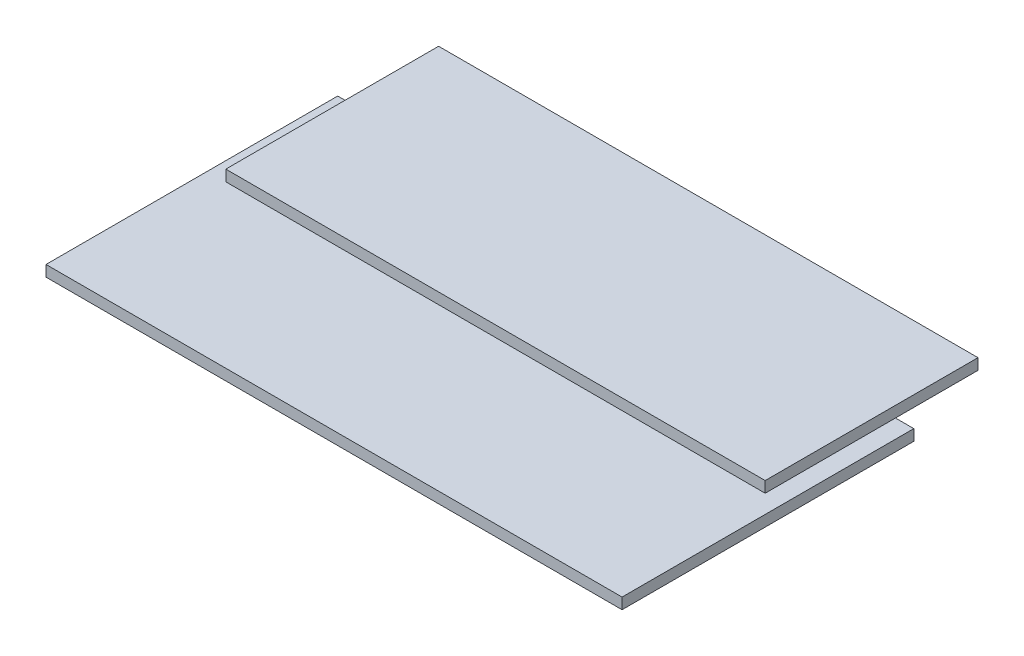
ISO-10303-21;
HEADER;
FILE_DESCRIPTION(('STEP AP214'),'2;1');
FILE_NAME('part.step','',(''),(''),'','','');
FILE_SCHEMA(('AUTOMOTIVE_DESIGN { 1 0 10303 214 1 1 1 1 }'));
ENDSEC;
DATA;
#1=APPLICATION_CONTEXT('core data for automotive mechanical design processes');
#2=APPLICATION_PROTOCOL_DEFINITION('international standard','automotive_design',2000,#1);
#3=PRODUCT_CONTEXT('',#1,'mechanical');
#4=PRODUCT('Part','Part','',(#3));
#5=PRODUCT_RELATED_PRODUCT_CATEGORY('part','',(#4));
#6=PRODUCT_DEFINITION_FORMATION('','',#4);
#7=PRODUCT_DEFINITION_CONTEXT('part definition',#1,'design');
#8=PRODUCT_DEFINITION('design','',#6,#7);
#9=PRODUCT_DEFINITION_SHAPE('','',#8);
#10=(LENGTH_UNIT() NAMED_UNIT(*) SI_UNIT(.MILLI.,.METRE.));
#11=(NAMED_UNIT(*) PLANE_ANGLE_UNIT() SI_UNIT($,.RADIAN.));
#12=(NAMED_UNIT(*) SI_UNIT($,.STERADIAN.) SOLID_ANGLE_UNIT());
#13=UNCERTAINTY_MEASURE_WITH_UNIT(LENGTH_MEASURE(1.E-05),#10,'distance_accuracy_value','');
#14=(GEOMETRIC_REPRESENTATION_CONTEXT(3) GLOBAL_UNCERTAINTY_ASSIGNED_CONTEXT((#13)) GLOBAL_UNIT_ASSIGNED_CONTEXT((#10,
#11,#12)) REPRESENTATION_CONTEXT('',''));
#15=CARTESIAN_POINT('',(0.,0.,0.));
#16=DIRECTION('',(0.,0.,1.));
#17=DIRECTION('',(1.,0.,0.));
#18=AXIS2_PLACEMENT_3D('',#15,#16,#17);
#19=CARTESIAN_POINT('',(39.25,0.75,-19.8768253820927));
#20=DIRECTION('',(-1.,0.,0.));
#21=DIRECTION('',(0.,0.,1.));
#22=AXIS2_PLACEMENT_3D('',#19,#20,#21);
#23=PLANE('',#22);
#24=DIRECTION('',(0.,0.,-1.));
#25=VECTOR('',#24,1.);
#26=CARTESIAN_POINT('',(39.25,-0.75,-19.8768253820927));
#27=LINE('',#26,#25);
#28=CARTESIAN_POINT('',(39.25,-0.75,19.8768253820927));
#29=VERTEX_POINT('',#28);
#30=CARTESIAN_POINT('',(39.25,-0.75,-19.8768253820927));
#31=VERTEX_POINT('',#30);
#32=EDGE_CURVE('E132',#29,#31,#27,.T.);
#33=ORIENTED_EDGE('',*,*,#32,.T.);
#34=DIRECTION('',(0.,-1.,0.));
#35=VECTOR('',#34,1.);
#36=CARTESIAN_POINT('',(39.25,0.75,-19.8768253820927));
#37=LINE('',#36,#35);
#38=CARTESIAN_POINT('',(39.25,0.75,-19.8768253820927));
#39=VERTEX_POINT('',#38);
#40=EDGE_CURVE('E45',#39,#31,#37,.T.);
#41=ORIENTED_EDGE('',*,*,#40,.F.);
#42=DIRECTION('',(0.,0.,-1.));
#43=VECTOR('',#42,1.);
#44=CARTESIAN_POINT('',(39.25,0.75,-19.8768253820927));
#45=LINE('',#44,#43);
#46=CARTESIAN_POINT('',(39.25,0.75,19.8768253820927));
#47=VERTEX_POINT('',#46);
#48=EDGE_CURVE('E142',#47,#39,#45,.T.);
#49=ORIENTED_EDGE('',*,*,#48,.F.);
#50=DIRECTION('',(0.,-1.,0.));
#51=VECTOR('',#50,1.);
#52=CARTESIAN_POINT('',(39.25,0.75,19.8768253820927));
#53=LINE('',#52,#51);
#54=EDGE_CURVE('E152',#47,#29,#53,.T.);
#55=ORIENTED_EDGE('',*,*,#54,.T.);
#56=EDGE_LOOP('',(#33,#41,#49,#55));
#57=FACE_BOUND('',#56,.T.);
#58=ADVANCED_FACE('F39',(#57),#23,.F.);
#59=CARTESIAN_POINT('',(-39.25,0.75,-19.8768253820927));
#60=DIRECTION('',(0.,0.,1.));
#61=DIRECTION('',(1.,0.,0.));
#62=AXIS2_PLACEMENT_3D('',#59,#60,#61);
#63=PLANE('',#62);
#64=DIRECTION('',(-1.,0.,0.));
#65=VECTOR('',#64,1.);
#66=CARTESIAN_POINT('',(-39.25,-0.75,-19.8768253820927));
#67=LINE('',#66,#65);
#68=CARTESIAN_POINT('',(-39.25,-0.75,-19.8768253820927));
#69=VERTEX_POINT('',#68);
#70=EDGE_CURVE('E140',#31,#69,#67,.T.);
#71=ORIENTED_EDGE('',*,*,#70,.T.);
#72=DIRECTION('',(0.,-1.,0.));
#73=VECTOR('',#72,1.);
#74=CARTESIAN_POINT('',(-39.25,0.75,-19.8768253820927));
#75=LINE('',#74,#73);
#76=CARTESIAN_POINT('',(-39.25,0.75,-19.8768253820927));
#77=VERTEX_POINT('',#76);
#78=EDGE_CURVE('E162',#77,#69,#75,.T.);
#79=ORIENTED_EDGE('',*,*,#78,.F.);
#80=DIRECTION('',(-1.,0.,0.));
#81=VECTOR('',#80,1.);
#82=CARTESIAN_POINT('',(-39.25,0.75,-19.8768253820927));
#83=LINE('',#82,#81);
#84=CARTESIAN_POINT('',(-36.75,0.75,-19.8768253820927));
#85=VERTEX_POINT('',#84);
#86=EDGE_CURVE('E147',#85,#77,#83,.T.);
#87=ORIENTED_EDGE('',*,*,#86,.F.);
#88=CARTESIAN_POINT('',(36.75,0.75,-19.8768253820927));
#89=VERTEX_POINT('',#88);
#90=EDGE_CURVE('E153',#89,#85,#83,.T.);
#91=ORIENTED_EDGE('',*,*,#90,.F.);
#92=EDGE_CURVE('E149',#39,#89,#83,.T.);
#93=ORIENTED_EDGE('',*,*,#92,.F.);
#94=ORIENTED_EDGE('',*,*,#40,.T.);
#95=EDGE_LOOP('',(#71,#79,#87,#91,#93,#94));
#96=FACE_BOUND('',#95,.T.);
#97=ADVANCED_FACE('F171',(#96),#63,.F.);
#98=CARTESIAN_POINT('',(-39.25,0.75,-19.8768253820927));
#99=DIRECTION('',(1.,0.,0.));
#100=DIRECTION('',(0.,0.,-1.));
#101=AXIS2_PLACEMENT_3D('',#98,#99,#100);
#102=PLANE('',#101);
#103=DIRECTION('',(0.,0.,1.));
#104=VECTOR('',#103,1.);
#105=CARTESIAN_POINT('',(-39.25,-0.75,-19.8768253820927));
#106=LINE('',#105,#104);
#107=CARTESIAN_POINT('',(-39.25,-0.75,19.8768253820927));
#108=VERTEX_POINT('',#107);
#109=EDGE_CURVE('E160',#69,#108,#106,.T.);
#110=ORIENTED_EDGE('',*,*,#109,.T.);
#111=DIRECTION('',(0.,-1.,0.));
#112=VECTOR('',#111,1.);
#113=CARTESIAN_POINT('',(-39.25,0.75,19.8768253820927));
#114=LINE('',#113,#112);
#115=CARTESIAN_POINT('',(-39.25,0.75,19.8768253820927));
#116=VERTEX_POINT('',#115);
#117=EDGE_CURVE('E165',#116,#108,#114,.T.);
#118=ORIENTED_EDGE('',*,*,#117,.F.);
#119=DIRECTION('',(0.,0.,1.));
#120=VECTOR('',#119,1.);
#121=CARTESIAN_POINT('',(-39.25,0.75,-19.8768253820927));
#122=LINE('',#121,#120);
#123=EDGE_CURVE('E148',#77,#116,#122,.T.);
#124=ORIENTED_EDGE('',*,*,#123,.F.);
#125=ORIENTED_EDGE('',*,*,#78,.T.);
#126=EDGE_LOOP('',(#110,#118,#124,#125));
#127=FACE_BOUND('',#126,.T.);
#128=ADVANCED_FACE('F185',(#127),#102,.F.);
#129=CARTESIAN_POINT('',(-39.25,0.75,19.8768253820927));
#130=DIRECTION('',(0.,0.,-1.));
#131=DIRECTION('',(-1.,0.,0.));
#132=AXIS2_PLACEMENT_3D('',#129,#130,#131);
#133=PLANE('',#132);
#134=DIRECTION('',(1.,0.,0.));
#135=VECTOR('',#134,1.);
#136=CARTESIAN_POINT('',(-39.25,-0.75,19.8768253820927));
#137=LINE('',#136,#135);
#138=EDGE_CURVE('E150',#108,#29,#137,.T.);
#139=ORIENTED_EDGE('',*,*,#138,.T.);
#140=ORIENTED_EDGE('',*,*,#54,.F.);
#141=DIRECTION('',(1.,0.,0.));
#142=VECTOR('',#141,1.);
#143=CARTESIAN_POINT('',(-39.25,0.75,19.8768253820927));
#144=LINE('',#143,#142);
#145=EDGE_CURVE('E151',#116,#47,#144,.T.);
#146=ORIENTED_EDGE('',*,*,#145,.F.);
#147=ORIENTED_EDGE('',*,*,#117,.T.);
#148=EDGE_LOOP('',(#139,#140,#146,#147));
#149=FACE_BOUND('',#148,.T.);
#150=ADVANCED_FACE('F184',(#149),#133,.F.);
#151=CARTESIAN_POINT('',(0.,0.75,0.));
#152=DIRECTION('',(0.,1.,0.));
#153=DIRECTION('',(0.,0.,1.));
#154=AXIS2_PLACEMENT_3D('',#151,#152,#153);
#155=PLANE('',#154);
#156=DIRECTION('',(0.,0.,-1.));
#157=VECTOR('',#156,1.);
#158=CARTESIAN_POINT('',(36.75,0.75,-2.12317461790731));
#159=LINE('',#158,#157);
#160=CARTESIAN_POINT('',(36.75,0.75,-2.12317461790731));
#161=VERTEX_POINT('',#160);
#162=EDGE_CURVE('E54',#161,#89,#159,.T.);
#163=ORIENTED_EDGE('',*,*,#162,.F.);
#164=DIRECTION('',(1.,0.,0.));
#165=VECTOR('',#164,1.);
#166=CARTESIAN_POINT('',(36.75,0.75,-2.12317461790731));
#167=LINE('',#166,#165);
#168=CARTESIAN_POINT('',(-36.75,0.75,-2.1231746179073));
#169=VERTEX_POINT('',#168);
#170=EDGE_CURVE('E126',#169,#161,#167,.T.);
#171=ORIENTED_EDGE('',*,*,#170,.F.);
#172=DIRECTION('',(0.,0.,1.));
#173=VECTOR('',#172,1.);
#174=CARTESIAN_POINT('',(-36.75,0.75,-2.1231746179073));
#175=LINE('',#174,#173);
#176=EDGE_CURVE('E11',#85,#169,#175,.T.);
#177=ORIENTED_EDGE('',*,*,#176,.F.);
#178=ORIENTED_EDGE('',*,*,#86,.T.);
#179=ORIENTED_EDGE('',*,*,#123,.T.);
#180=ORIENTED_EDGE('',*,*,#145,.T.);
#181=ORIENTED_EDGE('',*,*,#48,.T.);
#182=ORIENTED_EDGE('',*,*,#92,.T.);
#183=EDGE_LOOP('',(#163,#171,#177,#178,#179,#180,#181,#182));
#184=FACE_BOUND('',#183,.T.);
#185=ADVANCED_FACE('F186',(#184),#155,.T.);
#186=CARTESIAN_POINT('',(0.,-0.75,0.));
#187=DIRECTION('',(0.,1.,0.));
#188=DIRECTION('',(0.,0.,1.));
#189=AXIS2_PLACEMENT_3D('',#186,#187,#188);
#190=PLANE('',#189);
#191=ORIENTED_EDGE('',*,*,#32,.F.);
#192=ORIENTED_EDGE('',*,*,#138,.F.);
#193=ORIENTED_EDGE('',*,*,#109,.F.);
#194=ORIENTED_EDGE('',*,*,#70,.F.);
#195=EDGE_LOOP('',(#191,#192,#193,#194));
#196=FACE_BOUND('',#195,.T.);
#197=ADVANCED_FACE('F179',(#196),#190,.F.);
#198=CARTESIAN_POINT('',(0.,0.75,0.));
#199=DIRECTION('',(0.,1.,0.));
#200=DIRECTION('',(0.,0.,1.));
#201=AXIS2_PLACEMENT_3D('',#198,#199,#200);
#202=PLANE('',#201);
#203=CARTESIAN_POINT('',(36.75,0.75,-31.1231746179073));
#204=VERTEX_POINT('',#203);
#205=EDGE_CURVE('E135',#89,#204,#159,.T.);
#206=ORIENTED_EDGE('',*,*,#205,.F.);
#207=ORIENTED_EDGE('',*,*,#90,.T.);
#208=CARTESIAN_POINT('',(-36.75,0.75,-31.1231746179073));
#209=VERTEX_POINT('',#208);
#210=EDGE_CURVE('E48',#209,#85,#175,.T.);
#211=ORIENTED_EDGE('',*,*,#210,.F.);
#212=DIRECTION('',(-1.,0.,0.));
#213=VECTOR('',#212,1.);
#214=CARTESIAN_POINT('',(36.75,0.75,-31.1231746179073));
#215=LINE('',#214,#213);
#216=EDGE_CURVE('E198',#204,#209,#215,.T.);
#217=ORIENTED_EDGE('',*,*,#216,.F.);
#218=EDGE_LOOP('',(#206,#207,#211,#217));
#219=FACE_BOUND('',#218,.T.);
#220=ADVANCED_FACE('F192',(#219),#202,.F.);
#221=CARTESIAN_POINT('',(36.75,2.25,-2.12317461790731));
#222=DIRECTION('',(-1.,0.,0.));
#223=DIRECTION('',(0.,0.,1.));
#224=AXIS2_PLACEMENT_3D('',#221,#222,#223);
#225=PLANE('',#224);
#226=ORIENTED_EDGE('',*,*,#162,.T.);
#227=ORIENTED_EDGE('',*,*,#205,.T.);
#228=DIRECTION('',(0.,-1.,0.));
#229=VECTOR('',#228,1.);
#230=CARTESIAN_POINT('',(36.75,2.25,-31.1231746179073));
#231=LINE('',#230,#229);
#232=CARTESIAN_POINT('',(36.75,2.25,-31.1231746179073));
#233=VERTEX_POINT('',#232);
#234=EDGE_CURVE('E111',#233,#204,#231,.T.);
#235=ORIENTED_EDGE('',*,*,#234,.F.);
#236=DIRECTION('',(0.,0.,-1.));
#237=VECTOR('',#236,1.);
#238=CARTESIAN_POINT('',(36.75,2.25,-2.12317461790731));
#239=LINE('',#238,#237);
#240=CARTESIAN_POINT('',(36.75,2.25,-2.12317461790731));
#241=VERTEX_POINT('',#240);
#242=EDGE_CURVE('E117',#241,#233,#239,.T.);
#243=ORIENTED_EDGE('',*,*,#242,.F.);
#244=DIRECTION('',(0.,-1.,0.));
#245=VECTOR('',#244,1.);
#246=CARTESIAN_POINT('',(36.75,2.25,-2.12317461790731));
#247=LINE('',#246,#245);
#248=EDGE_CURVE('E202',#241,#161,#247,.T.);
#249=ORIENTED_EDGE('',*,*,#248,.T.);
#250=EDGE_LOOP('',(#226,#227,#235,#243,#249));
#251=FACE_BOUND('',#250,.T.);
#252=ADVANCED_FACE('F127',(#251),#225,.F.);
#253=CARTESIAN_POINT('',(36.75,2.25,-31.1231746179073));
#254=DIRECTION('',(0.,0.,1.));
#255=DIRECTION('',(1.,0.,0.));
#256=AXIS2_PLACEMENT_3D('',#253,#254,#255);
#257=PLANE('',#256);
#258=ORIENTED_EDGE('',*,*,#216,.T.);
#259=DIRECTION('',(0.,-1.,0.));
#260=VECTOR('',#259,1.);
#261=CARTESIAN_POINT('',(-36.75,2.25,-31.1231746179073));
#262=LINE('',#261,#260);
#263=CARTESIAN_POINT('',(-36.75,2.25,-31.1231746179073));
#264=VERTEX_POINT('',#263);
#265=EDGE_CURVE('E113',#264,#209,#262,.T.);
#266=ORIENTED_EDGE('',*,*,#265,.F.);
#267=DIRECTION('',(-1.,0.,0.));
#268=VECTOR('',#267,1.);
#269=CARTESIAN_POINT('',(36.75,2.25,-31.1231746179073));
#270=LINE('',#269,#268);
#271=EDGE_CURVE('E107',#233,#264,#270,.T.);
#272=ORIENTED_EDGE('',*,*,#271,.F.);
#273=ORIENTED_EDGE('',*,*,#234,.T.);
#274=EDGE_LOOP('',(#258,#266,#272,#273));
#275=FACE_BOUND('',#274,.T.);
#276=ADVANCED_FACE('F112',(#275),#257,.F.);
#277=CARTESIAN_POINT('',(-36.75,2.25,-2.1231746179073));
#278=DIRECTION('',(1.,0.,0.));
#279=DIRECTION('',(0.,0.,-1.));
#280=AXIS2_PLACEMENT_3D('',#277,#278,#279);
#281=PLANE('',#280);
#282=ORIENTED_EDGE('',*,*,#210,.T.);
#283=ORIENTED_EDGE('',*,*,#176,.T.);
#284=DIRECTION('',(0.,-1.,0.));
#285=VECTOR('',#284,1.);
#286=CARTESIAN_POINT('',(-36.75,2.25,-2.1231746179073));
#287=LINE('',#286,#285);
#288=CARTESIAN_POINT('',(-36.75,2.25,-2.1231746179073));
#289=VERTEX_POINT('',#288);
#290=EDGE_CURVE('E137',#289,#169,#287,.T.);
#291=ORIENTED_EDGE('',*,*,#290,.F.);
#292=DIRECTION('',(0.,0.,1.));
#293=VECTOR('',#292,1.);
#294=CARTESIAN_POINT('',(-36.75,2.25,-2.1231746179073));
#295=LINE('',#294,#293);
#296=EDGE_CURVE('E116',#264,#289,#295,.T.);
#297=ORIENTED_EDGE('',*,*,#296,.F.);
#298=ORIENTED_EDGE('',*,*,#265,.T.);
#299=EDGE_LOOP('',(#282,#283,#291,#297,#298));
#300=FACE_BOUND('',#299,.T.);
#301=ADVANCED_FACE('F194',(#300),#281,.F.);
#302=CARTESIAN_POINT('',(36.75,2.25,-2.12317461790731));
#303=DIRECTION('',(0.,0.,-1.));
#304=DIRECTION('',(-1.,0.,0.));
#305=AXIS2_PLACEMENT_3D('',#302,#303,#304);
#306=PLANE('',#305);
#307=ORIENTED_EDGE('',*,*,#170,.T.);
#308=ORIENTED_EDGE('',*,*,#248,.F.);
#309=DIRECTION('',(1.,0.,0.));
#310=VECTOR('',#309,1.);
#311=CARTESIAN_POINT('',(36.75,2.25,-2.12317461790731));
#312=LINE('',#311,#310);
#313=EDGE_CURVE('E125',#289,#241,#312,.T.);
#314=ORIENTED_EDGE('',*,*,#313,.F.);
#315=ORIENTED_EDGE('',*,*,#290,.T.);
#316=EDGE_LOOP('',(#307,#308,#314,#315));
#317=FACE_BOUND('',#316,.T.);
#318=ADVANCED_FACE('F201',(#317),#306,.F.);
#319=CARTESIAN_POINT('',(0.,2.25,0.));
#320=DIRECTION('',(0.,1.,0.));
#321=DIRECTION('',(0.,0.,1.));
#322=AXIS2_PLACEMENT_3D('',#319,#320,#321);
#323=PLANE('',#322);
#324=ORIENTED_EDGE('',*,*,#242,.T.);
#325=ORIENTED_EDGE('',*,*,#271,.T.);
#326=ORIENTED_EDGE('',*,*,#296,.T.);
#327=ORIENTED_EDGE('',*,*,#313,.T.);
#328=EDGE_LOOP('',(#324,#325,#326,#327));
#329=FACE_BOUND('',#328,.T.);
#330=ADVANCED_FACE('F122',(#329),#323,.T.);
#331=CLOSED_SHELL('',(#58,#97,#128,#150,#185,#197,#220,#252,#276,#301,#318,#330));
#332=MANIFOLD_SOLID_BREP('B2',#331);
#333=ADVANCED_BREP_SHAPE_REPRESENTATION('',(#18,#332),#14);
#334=SHAPE_DEFINITION_REPRESENTATION(#9,#333);
ENDSEC;
END-ISO-10303-21;
